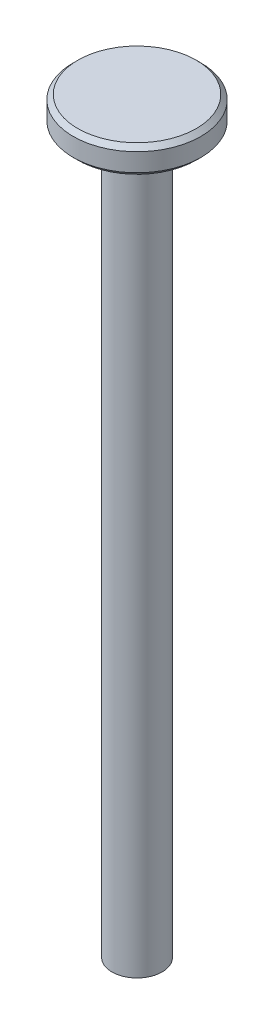
ISO-10303-21;
HEADER;
FILE_DESCRIPTION(('STEP AP214'),'2;1');
FILE_NAME('part.step','',(''),(''),'','','');
FILE_SCHEMA(('AUTOMOTIVE_DESIGN { 1 0 10303 214 1 1 1 1 }'));
ENDSEC;
DATA;
#1=APPLICATION_CONTEXT('core data for automotive mechanical design processes');
#2=APPLICATION_PROTOCOL_DEFINITION('international standard','automotive_design',2000,#1);
#3=PRODUCT_CONTEXT('',#1,'mechanical');
#4=PRODUCT('Part','Part','',(#3));
#5=PRODUCT_RELATED_PRODUCT_CATEGORY('part','',(#4));
#6=PRODUCT_DEFINITION_FORMATION('','',#4);
#7=PRODUCT_DEFINITION_CONTEXT('part definition',#1,'design');
#8=PRODUCT_DEFINITION('design','',#6,#7);
#9=PRODUCT_DEFINITION_SHAPE('','',#8);
#10=(LENGTH_UNIT() NAMED_UNIT(*) SI_UNIT(.MILLI.,.METRE.));
#11=(NAMED_UNIT(*) PLANE_ANGLE_UNIT() SI_UNIT($,.RADIAN.));
#12=(NAMED_UNIT(*) SI_UNIT($,.STERADIAN.) SOLID_ANGLE_UNIT());
#13=UNCERTAINTY_MEASURE_WITH_UNIT(LENGTH_MEASURE(1.E-05),#10,'distance_accuracy_value','');
#14=(GEOMETRIC_REPRESENTATION_CONTEXT(3) GLOBAL_UNCERTAINTY_ASSIGNED_CONTEXT((#13)) GLOBAL_UNIT_ASSIGNED_CONTEXT((#10,
#11,#12)) REPRESENTATION_CONTEXT('',''));
#15=CARTESIAN_POINT('',(0.,0.,0.));
#16=DIRECTION('',(0.,0.,1.));
#17=DIRECTION('',(1.,0.,0.));
#18=AXIS2_PLACEMENT_3D('',#15,#16,#17);
#19=CARTESIAN_POINT('',(1.75,0.,0.));
#20=DIRECTION('',(0.,-1.,0.));
#21=DIRECTION('',(1.,0.,0.));
#22=AXIS2_PLACEMENT_3D('',#19,#20,#21);
#23=PLANE('',#22);
#24=CARTESIAN_POINT('',(0.,0.,0.));
#25=DIRECTION('',(0.,-1.,0.));
#26=DIRECTION('',(1.,0.,0.));
#27=AXIS2_PLACEMENT_3D('',#24,#25,#26);
#28=CIRCLE('',#27,1.7500000000001);
#29=CARTESIAN_POINT('',(1.75,0.,0.));
#30=VERTEX_POINT('',#29);
#31=EDGE_CURVE('E63',#30,#30,#28,.T.);
#32=ORIENTED_EDGE('',*,*,#31,.T.);
#33=EDGE_LOOP('',(#32));
#34=FACE_BOUND('',#33,.T.);
#35=ADVANCED_FACE('F35',(#34),#23,.T.);
#36=CARTESIAN_POINT('',(0.,79.,0.));
#37=DIRECTION('',(0.,1.,0.));
#38=DIRECTION('',(-1.,0.,0.));
#39=AXIS2_PLACEMENT_3D('',#36,#37,#38);
#40=PLANE('',#39);
#41=CARTESIAN_POINT('',(-3.68767429393009E-13,79.,0.));
#42=DIRECTION('',(0.,-1.,0.));
#43=DIRECTION('',(1.,0.,0.));
#44=AXIS2_PLACEMENT_3D('',#41,#42,#43);
#45=CIRCLE('',#44,6.50000000000037);
#46=CARTESIAN_POINT('',(6.5,79.,0.));
#47=VERTEX_POINT('',#46);
#48=EDGE_CURVE('E10',#47,#47,#45,.T.);
#49=ORIENTED_EDGE('',*,*,#48,.F.);
#50=EDGE_LOOP('',(#49));
#51=FACE_BOUND('',#50,.T.);
#52=ADVANCED_FACE('F80',(#51),#40,.T.);
#53=CARTESIAN_POINT('',(-3.67052304893566E-13,78.5,0.));
#54=DIRECTION('',(0.,-1.,0.));
#55=DIRECTION('',(1.,0.,0.));
#56=AXIS2_PLACEMENT_3D('',#53,#54,#55);
#57=CONICAL_SURFACE('',#56,7.00000000000037,0.785398163397446);
#58=ORIENTED_EDGE('',*,*,#48,.T.);
#59=EDGE_LOOP('',(#58));
#60=FACE_BOUND('',#59,.T.);
#61=CARTESIAN_POINT('',(-3.67052304893566E-13,78.5,0.));
#62=DIRECTION('',(0.,-1.,0.));
#63=DIRECTION('',(1.,0.,0.));
#64=AXIS2_PLACEMENT_3D('',#61,#62,#63);
#65=CIRCLE('',#64,7.00000000000037);
#66=CARTESIAN_POINT('',(7.,78.5,0.));
#67=VERTEX_POINT('',#66);
#68=EDGE_CURVE('E41',#67,#67,#65,.T.);
#69=ORIENTED_EDGE('',*,*,#68,.F.);
#70=EDGE_LOOP('',(#69));
#71=FACE_BOUND('',#70,.T.);
#72=ADVANCED_FACE('F84',(#60,#71),#57,.T.);
#73=CARTESIAN_POINT('',(0.,-28.5045658530311,0.));
#74=DIRECTION('',(0.,-1.,0.));
#75=DIRECTION('',(1.,0.,0.));
#76=AXIS2_PLACEMENT_3D('',#73,#74,#75);
#77=CYLINDRICAL_SURFACE('',#76,7.00000000000036);
#78=ORIENTED_EDGE('',*,*,#68,.T.);
#79=EDGE_LOOP('',(#78));
#80=FACE_BOUND('',#79,.T.);
#81=CARTESIAN_POINT('',(-3.60191806895795E-13,76.5,0.));
#82=DIRECTION('',(0.,-1.,0.));
#83=DIRECTION('',(1.,0.,0.));
#84=AXIS2_PLACEMENT_3D('',#81,#82,#83);
#85=CIRCLE('',#84,7.00000000000036);
#86=CARTESIAN_POINT('',(7.,76.5,0.));
#87=VERTEX_POINT('',#86);
#88=EDGE_CURVE('E45',#87,#87,#85,.T.);
#89=ORIENTED_EDGE('',*,*,#88,.F.);
#90=EDGE_LOOP('',(#89));
#91=FACE_BOUND('',#90,.T.);
#92=ADVANCED_FACE('F89',(#80,#91),#77,.T.);
#93=CARTESIAN_POINT('',(-3.58476682396352E-13,76.,0.));
#94=DIRECTION('',(0.,1.,0.));
#95=DIRECTION('',(-1.,0.,0.));
#96=AXIS2_PLACEMENT_3D('',#93,#94,#95);
#97=CONICAL_SURFACE('',#96,6.50000000000036,0.78539816339745);
#98=ORIENTED_EDGE('',*,*,#88,.T.);
#99=EDGE_LOOP('',(#98));
#100=FACE_BOUND('',#99,.T.);
#101=CARTESIAN_POINT('',(-3.58476682396352E-13,76.,0.));
#102=DIRECTION('',(0.,-1.,0.));
#103=DIRECTION('',(1.,0.,0.));
#104=AXIS2_PLACEMENT_3D('',#101,#102,#103);
#105=CIRCLE('',#104,6.50000000000036);
#106=CARTESIAN_POINT('',(6.5,76.,0.));
#107=VERTEX_POINT('',#106);
#108=EDGE_CURVE('E49',#107,#107,#105,.T.);
#109=ORIENTED_EDGE('',*,*,#108,.F.);
#110=EDGE_LOOP('',(#109));
#111=FACE_BOUND('',#110,.T.);
#112=ADVANCED_FACE('F94',(#100,#111),#97,.T.);
#113=CARTESIAN_POINT('',(6.5,76.,0.));
#114=DIRECTION('',(0.,-1.,0.));
#115=DIRECTION('',(1.,0.,0.));
#116=AXIS2_PLACEMENT_3D('',#113,#114,#115);
#117=PLANE('',#116);
#118=ORIENTED_EDGE('',*,*,#108,.T.);
#119=EDGE_LOOP('',(#118));
#120=FACE_BOUND('',#119,.T.);
#121=CARTESIAN_POINT('',(-3.58476682396352E-13,76.,0.));
#122=DIRECTION('',(0.,-1.,0.));
#123=DIRECTION('',(1.,0.,0.));
#124=AXIS2_PLACEMENT_3D('',#121,#122,#123);
#125=CIRCLE('',#124,2.75000000000036);
#126=CARTESIAN_POINT('',(2.75,76.,0.));
#127=VERTEX_POINT('',#126);
#128=EDGE_CURVE('E54',#127,#127,#125,.T.);
#129=ORIENTED_EDGE('',*,*,#128,.F.);
#130=EDGE_LOOP('',(#129));
#131=FACE_BOUND('',#130,.T.);
#132=ADVANCED_FACE('F97',(#120,#131),#117,.T.);
#133=CARTESIAN_POINT('',(0.,-28.5045658530311,0.));
#134=DIRECTION('',(0.,-1.,0.));
#135=DIRECTION('',(1.,0.,0.));
#136=AXIS2_PLACEMENT_3D('',#133,#134,#135);
#137=CYLINDRICAL_SURFACE('',#136,2.75000000000023);
#138=ORIENTED_EDGE('',*,*,#128,.T.);
#139=EDGE_LOOP('',(#138));
#140=FACE_BOUND('',#139,.T.);
#141=CARTESIAN_POINT('',(0.,-3.00000000000001,0.));
#142=DIRECTION('',(0.,-1.,0.));
#143=DIRECTION('',(1.,0.,0.));
#144=AXIS2_PLACEMENT_3D('',#141,#142,#143);
#145=CIRCLE('',#144,2.7500000000001);
#146=CARTESIAN_POINT('',(2.75000000000001,-3.,0.));
#147=VERTEX_POINT('',#146);
#148=EDGE_CURVE('E57',#147,#147,#145,.T.);
#149=ORIENTED_EDGE('',*,*,#148,.F.);
#150=EDGE_LOOP('',(#149));
#151=FACE_BOUND('',#150,.T.);
#152=ADVANCED_FACE('F76',(#140,#151),#137,.T.);
#153=CARTESIAN_POINT('',(2.75000000000001,-3.,0.));
#154=DIRECTION('',(0.,-1.,0.));
#155=DIRECTION('',(1.,0.,0.));
#156=AXIS2_PLACEMENT_3D('',#153,#154,#155);
#157=PLANE('',#156);
#158=ORIENTED_EDGE('',*,*,#148,.T.);
#159=EDGE_LOOP('',(#158));
#160=FACE_BOUND('',#159,.T.);
#161=CARTESIAN_POINT('',(0.,-3.00000000000001,0.));
#162=DIRECTION('',(0.,-1.,0.));
#163=DIRECTION('',(1.,0.,0.));
#164=AXIS2_PLACEMENT_3D('',#161,#162,#163);
#165=CIRCLE('',#164,1.75000000000009);
#166=CARTESIAN_POINT('',(1.75,-3.,0.));
#167=VERTEX_POINT('',#166);
#168=EDGE_CURVE('E60',#167,#167,#165,.T.);
#169=ORIENTED_EDGE('',*,*,#168,.F.);
#170=EDGE_LOOP('',(#169));
#171=FACE_BOUND('',#170,.T.);
#172=ADVANCED_FACE('F70',(#160,#171),#157,.T.);
#173=CARTESIAN_POINT('',(0.,-28.5045658530311,0.));
#174=DIRECTION('',(0.,-1.,0.));
#175=DIRECTION('',(1.,0.,0.));
#176=AXIS2_PLACEMENT_3D('',#173,#174,#175);
#177=CYLINDRICAL_SURFACE('',#176,1.75000000000009);
#178=ORIENTED_EDGE('',*,*,#168,.T.);
#179=EDGE_LOOP('',(#178));
#180=FACE_BOUND('',#179,.T.);
#181=ORIENTED_EDGE('',*,*,#31,.F.);
#182=EDGE_LOOP('',(#181));
#183=FACE_BOUND('',#182,.T.);
#184=ADVANCED_FACE('F68',(#180,#183),#177,.F.);
#185=CLOSED_SHELL('',(#35,#52,#72,#92,#112,#132,#152,#172,#184));
#186=MANIFOLD_SOLID_BREP('B2',#185);
#187=ADVANCED_BREP_SHAPE_REPRESENTATION('',(#18,#186),#14);
#188=SHAPE_DEFINITION_REPRESENTATION(#9,#187);
ENDSEC;
END-ISO-10303-21;
